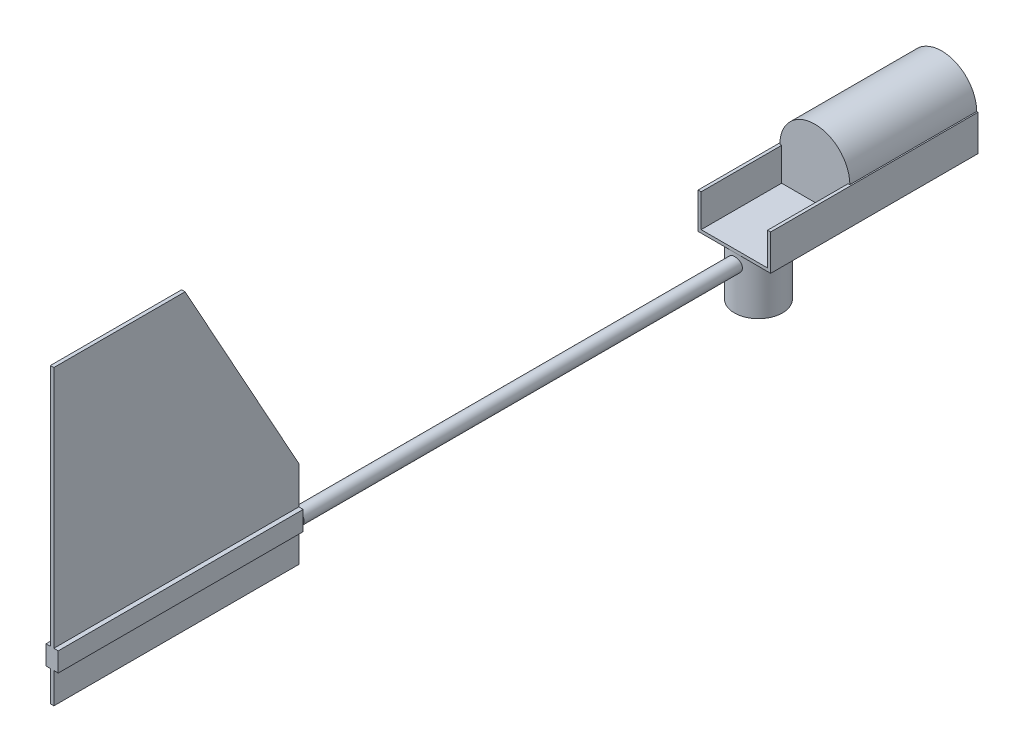
ISO-10303-21;
HEADER;
FILE_DESCRIPTION(('STEP AP214'),'2;1');
FILE_NAME('part.step','',(''),(''),'','','');
FILE_SCHEMA(('AUTOMOTIVE_DESIGN { 1 0 10303 214 1 1 1 1 }'));
ENDSEC;
DATA;
#1=APPLICATION_CONTEXT('core data for automotive mechanical design processes');
#2=APPLICATION_PROTOCOL_DEFINITION('international standard','automotive_design',2000,#1);
#3=PRODUCT_CONTEXT('',#1,'mechanical');
#4=PRODUCT('Part','Part','',(#3));
#5=PRODUCT_RELATED_PRODUCT_CATEGORY('part','',(#4));
#6=PRODUCT_DEFINITION_FORMATION('','',#4);
#7=PRODUCT_DEFINITION_CONTEXT('part definition',#1,'design');
#8=PRODUCT_DEFINITION('design','',#6,#7);
#9=PRODUCT_DEFINITION_SHAPE('','',#8);
#10=(LENGTH_UNIT() NAMED_UNIT(*) SI_UNIT(.MILLI.,.METRE.));
#11=(NAMED_UNIT(*) PLANE_ANGLE_UNIT() SI_UNIT($,.RADIAN.));
#12=(NAMED_UNIT(*) SI_UNIT($,.STERADIAN.) SOLID_ANGLE_UNIT());
#13=UNCERTAINTY_MEASURE_WITH_UNIT(LENGTH_MEASURE(1.E-05),#10,'distance_accuracy_value','');
#14=(GEOMETRIC_REPRESENTATION_CONTEXT(3) GLOBAL_UNCERTAINTY_ASSIGNED_CONTEXT((#13)) GLOBAL_UNIT_ASSIGNED_CONTEXT((#10,
#11,#12)) REPRESENTATION_CONTEXT('',''));
#15=CARTESIAN_POINT('',(0.,0.,0.));
#16=DIRECTION('',(0.,0.,1.));
#17=DIRECTION('',(1.,0.,0.));
#18=AXIS2_PLACEMENT_3D('',#15,#16,#17);
#19=CARTESIAN_POINT('',(0.,-53.,737.));
#20=DIRECTION('',(0.,0.,1.));
#21=DIRECTION('',(1.,0.,0.));
#22=AXIS2_PLACEMENT_3D('',#19,#20,#21);
#23=PLANE('',#22);
#24=CARTESIAN_POINT('',(0.,-53.,737.));
#25=DIRECTION('',(0.,0.,1.));
#26=DIRECTION('',(1.,0.,0.));
#27=AXIS2_PLACEMENT_3D('',#24,#25,#26);
#28=CIRCLE('',#27,8.);
#29=CARTESIAN_POINT('',(-7.,-49.1270166537926,737.));
#30=VERTEX_POINT('',#29);
#31=CARTESIAN_POINT('',(-7.,-56.8729833462074,737.));
#32=VERTEX_POINT('',#31);
#33=EDGE_CURVE('E347',#30,#32,#28,.T.);
#34=ORIENTED_EDGE('',*,*,#33,.T.);
#35=DIRECTION('',(0.,1.,0.));
#36=VECTOR('',#35,1.);
#37=CARTESIAN_POINT('',(-7.,-42.,737.));
#38=LINE('',#37,#36);
#39=EDGE_CURVE('E252',#32,#30,#38,.T.);
#40=ORIENTED_EDGE('',*,*,#39,.T.);
#41=EDGE_LOOP('',(#34,#40));
#42=FACE_BOUND('',#41,.T.);
#43=ADVANCED_FACE('F54',(#42),#23,.T.);
#44=CARTESIAN_POINT('',(-2.,0.,0.));
#45=DIRECTION('',(-1.,0.,0.));
#46=DIRECTION('',(0.,0.,1.));
#47=AXIS2_PLACEMENT_3D('',#44,#45,#46);
#48=PLANE('',#47);
#49=DIRECTION('',(0.,0.,-1.));
#50=VECTOR('',#49,1.);
#51=CARTESIAN_POINT('',(-2.,-64.,737.));
#52=LINE('',#51,#50);
#53=CARTESIAN_POINT('',(-2.,-64.0000000000001,1017.));
#54=VERTEX_POINT('',#53);
#55=CARTESIAN_POINT('',(-2.,-64.,737.));
#56=VERTEX_POINT('',#55);
#57=EDGE_CURVE('E265',#54,#56,#52,.T.);
#58=ORIENTED_EDGE('',*,*,#57,.T.);
#59=DIRECTION('',(0.,1.,0.));
#60=VECTOR('',#59,1.);
#61=CARTESIAN_POINT('',(-2.,1.,737.));
#62=LINE('',#61,#60);
#63=CARTESIAN_POINT('',(-2.,-99.,737.));
#64=VERTEX_POINT('',#63);
#65=EDGE_CURVE('E237',#64,#56,#62,.T.);
#66=ORIENTED_EDGE('',*,*,#65,.F.);
#67=DIRECTION('',(0.,0.,-1.));
#68=VECTOR('',#67,1.);
#69=CARTESIAN_POINT('',(-2.,-99.,737.));
#70=LINE('',#69,#68);
#71=CARTESIAN_POINT('',(-2.,-99.,1017.));
#72=VERTEX_POINT('',#71);
#73=EDGE_CURVE('E328',#72,#64,#70,.T.);
#74=ORIENTED_EDGE('',*,*,#73,.F.);
#75=DIRECTION('',(0.,-1.,0.));
#76=VECTOR('',#75,1.);
#77=CARTESIAN_POINT('',(-2.,-99.,1017.));
#78=LINE('',#77,#76);
#79=EDGE_CURVE('E324',#54,#72,#78,.T.);
#80=ORIENTED_EDGE('',*,*,#79,.F.);
#81=EDGE_LOOP('',(#58,#66,#74,#80));
#82=FACE_BOUND('',#81,.T.);
#83=ADVANCED_FACE('F492',(#82),#48,.T.);
#84=CARTESIAN_POINT('',(7.,-56.8729833462074,737.));
#85=VERTEX_POINT('',#84);
#86=CARTESIAN_POINT('',(7.,-49.1270166537926,737.));
#87=VERTEX_POINT('',#86);
#88=EDGE_CURVE('E337',#85,#87,#28,.T.);
#89=ORIENTED_EDGE('',*,*,#88,.T.);
#90=DIRECTION('',(0.,1.,0.));
#91=VECTOR('',#90,1.);
#92=CARTESIAN_POINT('',(7.,-42.,737.));
#93=LINE('',#92,#91);
#94=EDGE_CURVE('E279',#85,#87,#93,.T.);
#95=ORIENTED_EDGE('',*,*,#94,.F.);
#96=EDGE_LOOP('',(#89,#95));
#97=FACE_BOUND('',#96,.T.);
#98=ADVANCED_FACE('F495',(#97),#23,.T.);
#99=CARTESIAN_POINT('',(2.,0.,0.));
#100=DIRECTION('',(-1.,0.,0.));
#101=DIRECTION('',(0.,0.,1.));
#102=AXIS2_PLACEMENT_3D('',#99,#100,#101);
#103=PLANE('',#102);
#104=DIRECTION('',(0.,0.,1.));
#105=VECTOR('',#104,1.);
#106=CARTESIAN_POINT('',(2.,-42.,737.));
#107=LINE('',#106,#105);
#108=CARTESIAN_POINT('',(2.,-42.,737.));
#109=VERTEX_POINT('',#108);
#110=CARTESIAN_POINT('',(2.,-42.0000000000001,1017.));
#111=VERTEX_POINT('',#110);
#112=EDGE_CURVE('E241',#109,#111,#107,.T.);
#113=ORIENTED_EDGE('',*,*,#112,.F.);
#114=DIRECTION('',(0.,1.,0.));
#115=VECTOR('',#114,1.);
#116=CARTESIAN_POINT('',(2.,1.,737.));
#117=LINE('',#116,#115);
#118=CARTESIAN_POINT('',(2.,1.,737.));
#119=VERTEX_POINT('',#118);
#120=EDGE_CURVE('E315',#109,#119,#117,.T.);
#121=ORIENTED_EDGE('',*,*,#120,.T.);
#122=DIRECTION('',(0.,0.87503404241775,0.484061385167265));
#123=VECTOR('',#122,1.);
#124=CARTESIAN_POINT('',(2.,236.,867.));
#125=LINE('',#124,#123);
#126=CARTESIAN_POINT('',(2.,236.,867.));
#127=VERTEX_POINT('',#126);
#128=EDGE_CURVE('E303',#119,#127,#125,.T.);
#129=ORIENTED_EDGE('',*,*,#128,.T.);
#130=DIRECTION('',(0.,0.,1.));
#131=VECTOR('',#130,1.);
#132=CARTESIAN_POINT('',(2.,236.,1017.));
#133=LINE('',#132,#131);
#134=CARTESIAN_POINT('',(2.,236.,1017.));
#135=VERTEX_POINT('',#134);
#136=EDGE_CURVE('E306',#127,#135,#133,.T.);
#137=ORIENTED_EDGE('',*,*,#136,.T.);
#138=DIRECTION('',(0.,-1.,0.));
#139=VECTOR('',#138,1.);
#140=CARTESIAN_POINT('',(2.,-99.,1017.));
#141=LINE('',#140,#139);
#142=EDGE_CURVE('E310',#135,#111,#141,.T.);
#143=ORIENTED_EDGE('',*,*,#142,.T.);
#144=EDGE_LOOP('',(#113,#121,#129,#137,#143));
#145=FACE_BOUND('',#144,.T.);
#146=ADVANCED_FACE('F504',(#145),#103,.F.);
#147=DIRECTION('',(0.,0.,-1.));
#148=VECTOR('',#147,1.);
#149=CARTESIAN_POINT('',(2.,-64.,737.));
#150=LINE('',#149,#148);
#151=CARTESIAN_POINT('',(2.,-64.,1017.));
#152=VERTEX_POINT('',#151);
#153=CARTESIAN_POINT('',(2.,-64.,737.));
#154=VERTEX_POINT('',#153);
#155=EDGE_CURVE('E289',#152,#154,#150,.T.);
#156=ORIENTED_EDGE('',*,*,#155,.F.);
#157=CARTESIAN_POINT('',(2.,-99.,1017.));
#158=VERTEX_POINT('',#157);
#159=EDGE_CURVE('E309',#152,#158,#141,.T.);
#160=ORIENTED_EDGE('',*,*,#159,.T.);
#161=DIRECTION('',(0.,0.,-1.));
#162=VECTOR('',#161,1.);
#163=CARTESIAN_POINT('',(2.,-99.,737.));
#164=LINE('',#163,#162);
#165=CARTESIAN_POINT('',(2.,-99.,737.));
#166=VERTEX_POINT('',#165);
#167=EDGE_CURVE('E312',#158,#166,#164,.T.);
#168=ORIENTED_EDGE('',*,*,#167,.T.);
#169=EDGE_CURVE('E316',#166,#154,#117,.T.);
#170=ORIENTED_EDGE('',*,*,#169,.T.);
#171=EDGE_LOOP('',(#156,#160,#168,#170));
#172=FACE_BOUND('',#171,.T.);
#173=ADVANCED_FACE('F509',(#172),#103,.F.);
#174=CARTESIAN_POINT('',(0.,-41.,145.));
#175=DIRECTION('',(0.,1.,0.));
#176=DIRECTION('',(-1.,0.,0.));
#177=AXIS2_PLACEMENT_3D('',#174,#175,#176);
#178=PLANE('',#177);
#179=DIRECTION('',(1.,0.,0.));
#180=VECTOR('',#179,1.);
#181=CARTESIAN_POINT('',(41.5,-41.,237.));
#182=LINE('',#181,#180);
#183=CARTESIAN_POINT('',(0.,-41.,237.));
#184=VERTEX_POINT('',#183);
#185=CARTESIAN_POINT('',(41.5,-41.,237.));
#186=VERTEX_POINT('',#185);
#187=EDGE_CURVE('E358',#184,#186,#182,.T.);
#188=ORIENTED_EDGE('',*,*,#187,.F.);
#189=CARTESIAN_POINT('',(0.,-41.,209.5));
#190=DIRECTION('',(0.,-1.,0.));
#191=DIRECTION('',(1.,0.,0.));
#192=AXIS2_PLACEMENT_3D('',#189,#190,#191);
#193=CIRCLE('',#192,27.5);
#194=EDGE_CURVE('E352',#184,#184,#193,.T.);
#195=ORIENTED_EDGE('',*,*,#194,.F.);
#196=CARTESIAN_POINT('',(-41.5,-41.,237.));
#197=VERTEX_POINT('',#196);
#198=EDGE_CURVE('E360',#197,#184,#182,.T.);
#199=ORIENTED_EDGE('',*,*,#198,.F.);
#200=DIRECTION('',(0.,0.,-1.));
#201=VECTOR('',#200,1.);
#202=CARTESIAN_POINT('',(-41.5,-41.,145.));
#203=LINE('',#202,#201);
#204=CARTESIAN_POINT('',(-41.5,-41.,0.));
#205=VERTEX_POINT('',#204);
#206=EDGE_CURVE('E424',#197,#205,#203,.T.);
#207=ORIENTED_EDGE('',*,*,#206,.T.);
#208=DIRECTION('',(1.,0.,0.));
#209=VECTOR('',#208,1.);
#210=CARTESIAN_POINT('',(0.,-41.,0.));
#211=LINE('',#210,#209);
#212=CARTESIAN_POINT('',(41.5,-41.,0.));
#213=VERTEX_POINT('',#212);
#214=EDGE_CURVE('E439',#205,#213,#211,.T.);
#215=ORIENTED_EDGE('',*,*,#214,.T.);
#216=DIRECTION('',(0.,0.,-1.));
#217=VECTOR('',#216,1.);
#218=CARTESIAN_POINT('',(41.5,-41.,145.));
#219=LINE('',#218,#217);
#220=EDGE_CURVE('E428',#186,#213,#219,.T.);
#221=ORIENTED_EDGE('',*,*,#220,.F.);
#222=EDGE_LOOP('',(#188,#195,#199,#207,#215,#221));
#223=FACE_BOUND('',#222,.T.);
#224=ADVANCED_FACE('F459',(#223),#178,.F.);
#225=CARTESIAN_POINT('',(0.,0.,145.));
#226=DIRECTION('',(0.,1.,0.));
#227=DIRECTION('',(0.,0.,1.));
#228=AXIS2_PLACEMENT_3D('',#225,#226,#227);
#229=PLANE('',#228);
#230=DIRECTION('',(1.,0.,0.));
#231=VECTOR('',#230,1.);
#232=CARTESIAN_POINT('',(0.,0.,0.));
#233=LINE('',#232,#231);
#234=CARTESIAN_POINT('',(-41.5,0.,0.));
#235=VERTEX_POINT('',#234);
#236=CARTESIAN_POINT('',(-40.,0.,0.));
#237=VERTEX_POINT('',#236);
#238=EDGE_CURVE('E400',#235,#237,#233,.T.);
#239=ORIENTED_EDGE('',*,*,#238,.F.);
#240=DIRECTION('',(0.,0.,-1.));
#241=VECTOR('',#240,1.);
#242=CARTESIAN_POINT('',(-41.5,0.,145.));
#243=LINE('',#242,#241);
#244=CARTESIAN_POINT('',(-41.5,0.,237.));
#245=VERTEX_POINT('',#244);
#246=EDGE_CURVE('E419',#245,#235,#243,.T.);
#247=ORIENTED_EDGE('',*,*,#246,.F.);
#248=DIRECTION('',(-1.,0.,0.));
#249=VECTOR('',#248,1.);
#250=CARTESIAN_POINT('',(-41.5,0.,237.));
#251=LINE('',#250,#249);
#252=CARTESIAN_POINT('',(-38.,0.,237.));
#253=VERTEX_POINT('',#252);
#254=EDGE_CURVE('E373',#253,#245,#251,.T.);
#255=ORIENTED_EDGE('',*,*,#254,.F.);
#256=DIRECTION('',(0.,0.,-1.));
#257=VECTOR('',#256,1.);
#258=CARTESIAN_POINT('',(-38.,0.,237.));
#259=LINE('',#258,#257);
#260=CARTESIAN_POINT('',(-38.,0.,145.));
#261=VERTEX_POINT('',#260);
#262=EDGE_CURVE('E376',#253,#261,#259,.T.);
#263=ORIENTED_EDGE('',*,*,#262,.T.);
#264=DIRECTION('',(-1.,0.,0.));
#265=VECTOR('',#264,1.);
#266=CARTESIAN_POINT('',(-41.5,0.,145.));
#267=LINE('',#266,#265);
#268=CARTESIAN_POINT('',(-40.,0.,145.));
#269=VERTEX_POINT('',#268);
#270=EDGE_CURVE('E359',#261,#269,#267,.T.);
#271=ORIENTED_EDGE('',*,*,#270,.T.);
#272=DIRECTION('',(0.,0.,-1.));
#273=VECTOR('',#272,1.);
#274=CARTESIAN_POINT('',(-40.,0.,145.));
#275=LINE('',#274,#273);
#276=EDGE_CURVE('E67',#269,#237,#275,.T.);
#277=ORIENTED_EDGE('',*,*,#276,.T.);
#278=EDGE_LOOP('',(#239,#247,#255,#263,#271,#277));
#279=FACE_BOUND('',#278,.T.);
#280=ADVANCED_FACE('F448',(#279),#229,.T.);
#281=CARTESIAN_POINT('',(-41.5,0.,145.));
#282=DIRECTION('',(-1.,0.,0.));
#283=DIRECTION('',(0.,0.,1.));
#284=AXIS2_PLACEMENT_3D('',#281,#282,#283);
#285=PLANE('',#284);
#286=DIRECTION('',(0.,1.,0.));
#287=VECTOR('',#286,1.);
#288=CARTESIAN_POINT('',(-41.5,0.,0.));
#289=LINE('',#288,#287);
#290=EDGE_CURVE('E440',#205,#235,#289,.T.);
#291=ORIENTED_EDGE('',*,*,#290,.F.);
#292=ORIENTED_EDGE('',*,*,#206,.F.);
#293=DIRECTION('',(0.,-1.,0.));
#294=VECTOR('',#293,1.);
#295=CARTESIAN_POINT('',(-41.5,-41.,237.));
#296=LINE('',#295,#294);
#297=EDGE_CURVE('E355',#245,#197,#296,.T.);
#298=ORIENTED_EDGE('',*,*,#297,.F.);
#299=ORIENTED_EDGE('',*,*,#246,.T.);
#300=EDGE_LOOP('',(#291,#292,#298,#299));
#301=FACE_BOUND('',#300,.T.);
#302=ADVANCED_FACE('F454',(#301),#285,.T.);
#303=CARTESIAN_POINT('',(41.5,0.,145.));
#304=DIRECTION('',(-1.,0.,0.));
#305=DIRECTION('',(0.,0.,1.));
#306=AXIS2_PLACEMENT_3D('',#303,#304,#305);
#307=PLANE('',#306);
#308=DIRECTION('',(0.,1.,0.));
#309=VECTOR('',#308,1.);
#310=CARTESIAN_POINT('',(41.5,0.,0.));
#311=LINE('',#310,#309);
#312=CARTESIAN_POINT('',(41.5,0.,0.));
#313=VERTEX_POINT('',#312);
#314=EDGE_CURVE('E437',#213,#313,#311,.T.);
#315=ORIENTED_EDGE('',*,*,#314,.T.);
#316=DIRECTION('',(0.,0.,-1.));
#317=VECTOR('',#316,1.);
#318=CARTESIAN_POINT('',(41.5,0.,145.));
#319=LINE('',#318,#317);
#320=CARTESIAN_POINT('',(41.5,0.,237.));
#321=VERTEX_POINT('',#320);
#322=EDGE_CURVE('E410',#321,#313,#319,.T.);
#323=ORIENTED_EDGE('',*,*,#322,.F.);
#324=DIRECTION('',(0.,1.,0.));
#325=VECTOR('',#324,1.);
#326=CARTESIAN_POINT('',(41.5,0.,237.));
#327=LINE('',#326,#325);
#328=EDGE_CURVE('E362',#186,#321,#327,.T.);
#329=ORIENTED_EDGE('',*,*,#328,.F.);
#330=ORIENTED_EDGE('',*,*,#220,.T.);
#331=EDGE_LOOP('',(#315,#323,#329,#330));
#332=FACE_BOUND('',#331,.T.);
#333=ADVANCED_FACE('F464',(#332),#307,.F.);
#334=CARTESIAN_POINT('',(0.,0.,145.));
#335=DIRECTION('',(0.,-1.,0.));
#336=DIRECTION('',(0.,0.,-1.));
#337=AXIS2_PLACEMENT_3D('',#334,#335,#336);
#338=PLANE('',#337);
#339=DIRECTION('',(-1.,0.,0.));
#340=VECTOR('',#339,1.);
#341=CARTESIAN_POINT('',(0.,0.,0.));
#342=LINE('',#341,#340);
#343=CARTESIAN_POINT('',(40.,0.,0.));
#344=VERTEX_POINT('',#343);
#345=EDGE_CURVE('E411',#313,#344,#342,.T.);
#346=ORIENTED_EDGE('',*,*,#345,.T.);
#347=DIRECTION('',(0.,0.,-1.));
#348=VECTOR('',#347,1.);
#349=CARTESIAN_POINT('',(40.,0.,145.));
#350=LINE('',#349,#348);
#351=CARTESIAN_POINT('',(40.,0.,145.));
#352=VERTEX_POINT('',#351);
#353=EDGE_CURVE('E408',#352,#344,#350,.T.);
#354=ORIENTED_EDGE('',*,*,#353,.F.);
#355=DIRECTION('',(-1.,0.,0.));
#356=VECTOR('',#355,1.);
#357=CARTESIAN_POINT('',(38.,0.,145.));
#358=LINE('',#357,#356);
#359=CARTESIAN_POINT('',(38.,0.,145.));
#360=VERTEX_POINT('',#359);
#361=EDGE_CURVE('E12',#352,#360,#358,.T.);
#362=ORIENTED_EDGE('',*,*,#361,.T.);
#363=DIRECTION('',(0.,0.,-1.));
#364=VECTOR('',#363,1.);
#365=CARTESIAN_POINT('',(38.,0.,237.));
#366=LINE('',#365,#364);
#367=CARTESIAN_POINT('',(38.,0.,237.));
#368=VERTEX_POINT('',#367);
#369=EDGE_CURVE('E393',#368,#360,#366,.T.);
#370=ORIENTED_EDGE('',*,*,#369,.F.);
#371=DIRECTION('',(-1.,0.,0.));
#372=VECTOR('',#371,1.);
#373=CARTESIAN_POINT('',(38.,0.,237.));
#374=LINE('',#373,#372);
#375=EDGE_CURVE('E365',#321,#368,#374,.T.);
#376=ORIENTED_EDGE('',*,*,#375,.F.);
#377=ORIENTED_EDGE('',*,*,#322,.T.);
#378=EDGE_LOOP('',(#346,#354,#362,#370,#376,#377));
#379=FACE_BOUND('',#378,.T.);
#380=ADVANCED_FACE('F468',(#379),#338,.F.);
#381=CARTESIAN_POINT('',(0.,0.,0.));
#382=DIRECTION('',(0.,0.,1.));
#383=DIRECTION('',(1.,0.,0.));
#384=AXIS2_PLACEMENT_3D('',#381,#382,#383);
#385=PLANE('',#384);
#386=ORIENTED_EDGE('',*,*,#238,.T.);
#387=CARTESIAN_POINT('',(0.,0.,0.));
#388=DIRECTION('',(0.,0.,1.));
#389=DIRECTION('',(1.,0.,0.));
#390=AXIS2_PLACEMENT_3D('',#387,#388,#389);
#391=CIRCLE('',#390,40.);
#392=EDGE_CURVE('E396',#344,#237,#391,.T.);
#393=ORIENTED_EDGE('',*,*,#392,.F.);
#394=ORIENTED_EDGE('',*,*,#345,.F.);
#395=ORIENTED_EDGE('',*,*,#314,.F.);
#396=ORIENTED_EDGE('',*,*,#214,.F.);
#397=ORIENTED_EDGE('',*,*,#290,.T.);
#398=EDGE_LOOP('',(#386,#393,#394,#395,#396,#397));
#399=FACE_BOUND('',#398,.T.);
#400=ADVANCED_FACE('F446',(#399),#385,.F.);
#401=CARTESIAN_POINT('',(0.,0.,145.));
#402=DIRECTION('',(0.,0.,1.));
#403=DIRECTION('',(1.,0.,0.));
#404=AXIS2_PLACEMENT_3D('',#401,#402,#403);
#405=PLANE('',#404);
#406=ORIENTED_EDGE('',*,*,#270,.F.);
#407=DIRECTION('',(0.,1.,0.));
#408=VECTOR('',#407,1.);
#409=CARTESIAN_POINT('',(-38.,0.,145.));
#410=LINE('',#409,#408);
#411=CARTESIAN_POINT('',(-38.,-37.5,145.));
#412=VERTEX_POINT('',#411);
#413=EDGE_CURVE('E382',#412,#261,#410,.T.);
#414=ORIENTED_EDGE('',*,*,#413,.F.);
#415=DIRECTION('',(-1.,0.,0.));
#416=VECTOR('',#415,1.);
#417=CARTESIAN_POINT('',(-38.,-37.5,145.));
#418=LINE('',#417,#416);
#419=CARTESIAN_POINT('',(38.,-37.5,145.));
#420=VERTEX_POINT('',#419);
#421=EDGE_CURVE('E379',#420,#412,#418,.T.);
#422=ORIENTED_EDGE('',*,*,#421,.F.);
#423=DIRECTION('',(0.,-1.,0.));
#424=VECTOR('',#423,1.);
#425=CARTESIAN_POINT('',(38.,-37.5,145.));
#426=LINE('',#425,#424);
#427=EDGE_CURVE('E351',#360,#420,#426,.T.);
#428=ORIENTED_EDGE('',*,*,#427,.F.);
#429=ORIENTED_EDGE('',*,*,#361,.F.);
#430=CARTESIAN_POINT('',(0.,0.,145.));
#431=DIRECTION('',(0.,0.,1.));
#432=DIRECTION('',(1.,0.,0.));
#433=AXIS2_PLACEMENT_3D('',#430,#431,#432);
#434=CIRCLE('',#433,40.);
#435=EDGE_CURVE('E414',#352,#269,#434,.T.);
#436=ORIENTED_EDGE('',*,*,#435,.T.);
#437=EDGE_LOOP('',(#406,#414,#422,#428,#429,#436));
#438=FACE_BOUND('',#437,.T.);
#439=ADVANCED_FACE('F481',(#438),#405,.T.);
#440=CARTESIAN_POINT('',(0.,0.,145.));
#441=DIRECTION('',(0.,0.,-1.));
#442=DIRECTION('',(-1.,0.,0.));
#443=AXIS2_PLACEMENT_3D('',#440,#441,#442);
#444=CYLINDRICAL_SURFACE('',#443,40.);
#445=ORIENTED_EDGE('',*,*,#276,.F.);
#446=ORIENTED_EDGE('',*,*,#435,.F.);
#447=ORIENTED_EDGE('',*,*,#353,.T.);
#448=ORIENTED_EDGE('',*,*,#392,.T.);
#449=EDGE_LOOP('',(#445,#446,#447,#448));
#450=FACE_BOUND('',#449,.T.);
#451=ADVANCED_FACE('F56',(#450),#444,.T.);
#452=CARTESIAN_POINT('',(38.,-37.5,237.));
#453=DIRECTION('',(1.,0.,0.));
#454=DIRECTION('',(0.,0.,-1.));
#455=AXIS2_PLACEMENT_3D('',#452,#453,#454);
#456=PLANE('',#455);
#457=ORIENTED_EDGE('',*,*,#427,.T.);
#458=DIRECTION('',(0.,0.,-1.));
#459=VECTOR('',#458,1.);
#460=CARTESIAN_POINT('',(38.,-37.5,237.));
#461=LINE('',#460,#459);
#462=CARTESIAN_POINT('',(38.,-37.5,237.));
#463=VERTEX_POINT('',#462);
#464=EDGE_CURVE('E390',#463,#420,#461,.T.);
#465=ORIENTED_EDGE('',*,*,#464,.F.);
#466=DIRECTION('',(0.,-1.,0.));
#467=VECTOR('',#466,1.);
#468=CARTESIAN_POINT('',(38.,-37.5,237.));
#469=LINE('',#468,#467);
#470=EDGE_CURVE('E367',#368,#463,#469,.T.);
#471=ORIENTED_EDGE('',*,*,#470,.F.);
#472=ORIENTED_EDGE('',*,*,#369,.T.);
#473=EDGE_LOOP('',(#457,#465,#471,#472));
#474=FACE_BOUND('',#473,.T.);
#475=ADVANCED_FACE('F473',(#474),#456,.F.);
#476=CARTESIAN_POINT('',(-38.,-37.5,237.));
#477=DIRECTION('',(0.,-1.,0.));
#478=DIRECTION('',(0.,0.,-1.));
#479=AXIS2_PLACEMENT_3D('',#476,#477,#478);
#480=PLANE('',#479);
#481=ORIENTED_EDGE('',*,*,#421,.T.);
#482=DIRECTION('',(0.,0.,-1.));
#483=VECTOR('',#482,1.);
#484=CARTESIAN_POINT('',(-38.,-37.5,237.));
#485=LINE('',#484,#483);
#486=CARTESIAN_POINT('',(-38.,-37.5,237.));
#487=VERTEX_POINT('',#486);
#488=EDGE_CURVE('E387',#487,#412,#485,.T.);
#489=ORIENTED_EDGE('',*,*,#488,.F.);
#490=DIRECTION('',(-1.,0.,0.));
#491=VECTOR('',#490,1.);
#492=CARTESIAN_POINT('',(-38.,-37.5,237.));
#493=LINE('',#492,#491);
#494=EDGE_CURVE('E369',#463,#487,#493,.T.);
#495=ORIENTED_EDGE('',*,*,#494,.F.);
#496=ORIENTED_EDGE('',*,*,#464,.T.);
#497=EDGE_LOOP('',(#481,#489,#495,#496));
#498=FACE_BOUND('',#497,.T.);
#499=ADVANCED_FACE('F477',(#498),#480,.F.);
#500=CARTESIAN_POINT('',(-38.,0.,237.));
#501=DIRECTION('',(-1.,0.,0.));
#502=DIRECTION('',(0.,-1.,0.));
#503=AXIS2_PLACEMENT_3D('',#500,#501,#502);
#504=PLANE('',#503);
#505=ORIENTED_EDGE('',*,*,#413,.T.);
#506=ORIENTED_EDGE('',*,*,#262,.F.);
#507=DIRECTION('',(0.,1.,0.));
#508=VECTOR('',#507,1.);
#509=CARTESIAN_POINT('',(-38.,0.,237.));
#510=LINE('',#509,#508);
#511=EDGE_CURVE('E371',#487,#253,#510,.T.);
#512=ORIENTED_EDGE('',*,*,#511,.F.);
#513=ORIENTED_EDGE('',*,*,#488,.T.);
#514=EDGE_LOOP('',(#505,#506,#512,#513));
#515=FACE_BOUND('',#514,.T.);
#516=ADVANCED_FACE('F479',(#515),#504,.F.);
#517=CARTESIAN_POINT('',(0.,0.,237.));
#518=DIRECTION('',(0.,0.,-1.));
#519=DIRECTION('',(-1.,0.,0.));
#520=AXIS2_PLACEMENT_3D('',#517,#518,#519);
#521=PLANE('',#520);
#522=ORIENTED_EDGE('',*,*,#297,.T.);
#523=ORIENTED_EDGE('',*,*,#198,.T.);
#524=ORIENTED_EDGE('',*,*,#187,.T.);
#525=ORIENTED_EDGE('',*,*,#328,.T.);
#526=ORIENTED_EDGE('',*,*,#375,.T.);
#527=ORIENTED_EDGE('',*,*,#470,.T.);
#528=ORIENTED_EDGE('',*,*,#494,.T.);
#529=ORIENTED_EDGE('',*,*,#511,.T.);
#530=ORIENTED_EDGE('',*,*,#254,.T.);
#531=EDGE_LOOP('',(#522,#523,#524,#525,#526,#527,#528,#529,#530));
#532=FACE_BOUND('',#531,.T.);
#533=ADVANCED_FACE('F451',(#532),#521,.F.);
#534=CARTESIAN_POINT('',(0.,-101.,209.5));
#535=DIRECTION('',(0.,1.,0.));
#536=DIRECTION('',(-1.,0.,0.));
#537=AXIS2_PLACEMENT_3D('',#534,#535,#536);
#538=CYLINDRICAL_SURFACE('',#537,27.5);
#539=CARTESIAN_POINT('',(8.,-53.,235.810644233846));
#540=CARTESIAN_POINT('',(7.99999945179375,-53.2195284933203,235.810644627825));
#541=CARTESIAN_POINT('',(7.99095621605924,-53.4390667886356,235.81339923787));
#542=CARTESIAN_POINT('',(7.9548648481875,-53.8765283572211,235.8243323868));
#543=CARTESIAN_POINT('',(7.92781563727063,-54.0944515329347,235.832511250665));
#544=CARTESIAN_POINT('',(7.85595348818416,-54.5271190259457,235.854039520795));
#545=CARTESIAN_POINT('',(7.81113805914129,-54.7418628931139,235.867389652081));
#546=CARTESIAN_POINT('',(7.70411785226968,-55.1666961779149,235.898857457303));
#547=CARTESIAN_POINT('',(7.64190660087654,-55.3767838313439,235.916976905913));
#548=CARTESIAN_POINT('',(7.50076476429704,-55.7903724571894,235.957397832435));
#549=CARTESIAN_POINT('',(7.4218678506472,-55.9938857572067,235.979690877816));
#550=CARTESIAN_POINT('',(7.24786837620966,-56.39351113375,236.027844803789));
#551=CARTESIAN_POINT('',(7.15275971697762,-56.5896203910291,236.053707026315));
#552=CARTESIAN_POINT('',(6.94709150128411,-56.9730640283653,236.108254898182));
#553=CARTESIAN_POINT('',(6.83653691259477,-57.160401203966,236.13693963886));
#554=CARTESIAN_POINT('',(6.60066425359247,-57.5253126314915,236.196367260479));
#555=CARTESIAN_POINT('',(6.47533940898102,-57.7028823484327,236.227111082993));
#556=CARTESIAN_POINT('',(6.20721453337387,-58.0517503791642,236.290669500611));
#557=CARTESIAN_POINT('',(6.06403456301979,-58.2227506992119,236.323517573984));
#558=CARTESIAN_POINT('',(5.76401140950861,-58.5520963289051,236.389584444811));
#559=CARTESIAN_POINT('',(5.6071740347035,-58.7104469639218,236.422803079479));
#560=CARTESIAN_POINT('',(5.28069238559433,-59.0136463838054,236.488738957744));
#561=CARTESIAN_POINT('',(5.11104139596731,-59.1584879987896,236.521455927475));
#562=CARTESIAN_POINT('',(4.7601383199541,-59.4335654883437,236.585473490349));
#563=CARTESIAN_POINT('',(4.57889061664411,-59.5638068305849,236.616774611079));
#564=CARTESIAN_POINT('',(4.20218730322294,-59.8112703623205,236.677724964595));
#565=CARTESIAN_POINT('',(4.00652158072099,-59.9281840946707,236.707329279453));
#566=CARTESIAN_POINT('',(3.60564297750063,-60.1450156390913,236.763350455151));
#567=CARTESIAN_POINT('',(3.40043361854105,-60.2449396582554,236.789768479053));
#568=CARTESIAN_POINT('',(2.98181835773692,-60.4270356591263,236.838675208877));
#569=CARTESIAN_POINT('',(2.76841216822794,-60.5092070171391,236.861163776741));
#570=CARTESIAN_POINT('',(2.33495675241617,-60.6550808217308,236.901557354158));
#571=CARTESIAN_POINT('',(2.11490773877811,-60.7187838588674,236.919462510272));
#572=CARTESIAN_POINT('',(1.67582913052341,-60.8256798539661,236.949748803035));
#573=CARTESIAN_POINT('',(1.45693234498932,-60.86938001515,236.962266000804));
#574=CARTESIAN_POINT('',(1.01602435059151,-60.9383549643468,236.982110282693));
#575=CARTESIAN_POINT('',(0.794013235217727,-60.9636303042582,236.989437522274));
#576=CARTESIAN_POINT('',(0.348579101650477,-60.9955201353201,236.998692858357));
#577=CARTESIAN_POINT('',(0.125156321761038,-61.0021376959779,237.000621842959));
#578=CARTESIAN_POINT('',(-0.321438115795961,-60.9966583042656,236.99902791463));
#579=CARTESIAN_POINT('',(-0.54460977770968,-60.9845616732415,236.995505095312));
#580=CARTESIAN_POINT('',(-0.98229608355238,-60.9424155552607,236.98329630064));
#581=CARTESIAN_POINT('',(-1.19686869266525,-60.9129190262602,236.974769393356));
#582=CARTESIAN_POINT('',(-1.62275153736993,-60.8366759451434,236.952907981206));
#583=CARTESIAN_POINT('',(-1.83406065454031,-60.7899236102656,236.939571864714));
#584=CARTESIAN_POINT('',(-2.25182274086715,-60.679580482754,236.908450496183));
#585=CARTESIAN_POINT('',(-2.45827725208359,-60.6159951179863,236.890666678421));
#586=CARTESIAN_POINT('',(-2.86510695360696,-60.4724634052202,236.851105128938));
#587=CARTESIAN_POINT('',(-3.06547982745752,-60.3925109107033,236.829325897098));
#588=CARTESIAN_POINT('',(-3.46091265017092,-60.2159183913119,236.782085052425));
#589=CARTESIAN_POINT('',(-3.65589166489465,-60.119107182847,236.756586149253));
#590=CARTESIAN_POINT('',(-4.03708189332403,-59.9100823104785,236.70273957043));
#591=CARTESIAN_POINT('',(-4.22329006643244,-59.7978633571734,236.674390917372));
#592=CARTESIAN_POINT('',(-4.58573407039554,-59.5588238727349,236.615581395908));
#593=CARTESIAN_POINT('',(-4.76196974499262,-59.4320031129024,236.58512049442));
#594=CARTESIAN_POINT('',(-5.10341510015708,-59.1645909449079,236.522865809452));
#595=CARTESIAN_POINT('',(-5.26862447884707,-59.0239991599833,236.491071989518));
#596=CARTESIAN_POINT('',(-5.59285522425001,-58.7245463331405,236.425792664372));
#597=CARTESIAN_POINT('',(-5.75142981966767,-58.5652054123816,236.3922877979));
#598=CARTESIAN_POINT('',(-6.05459840673731,-58.2337620161093,236.325657969952));
#599=CARTESIAN_POINT('',(-6.19919690528551,-58.0616636863443,236.292532889063));
#600=CARTESIAN_POINT('',(-6.47357454289551,-57.70567289183,236.22756486731));
#601=CARTESIAN_POINT('',(-6.60334681054028,-57.5217750195851,236.195722525338));
#602=CARTESIAN_POINT('',(-6.84703903832334,-57.1435074642631,236.134260790969));
#603=CARTESIAN_POINT('',(-6.96096515364381,-56.9491418881224,236.104640537509));
#604=CARTESIAN_POINT('',(-7.1731290701947,-56.5493502614839,236.048227509));
#605=CARTESIAN_POINT('',(-7.27121673583654,-56.3438405328447,236.02146252608));
#606=CARTESIAN_POINT('',(-7.44962594219684,-55.9248747149302,235.971903010099));
#607=CARTESIAN_POINT('',(-7.52995423618211,-55.7114216824145,235.949106968492));
#608=CARTESIAN_POINT('',(-7.67219415037952,-55.278035646122,235.908197961217));
#609=CARTESIAN_POINT('',(-7.73410675888565,-55.0581029907764,235.890084744247));
#610=CARTESIAN_POINT('',(-7.83894997664924,-54.6133958737486,235.859132348663));
#611=CARTESIAN_POINT('',(-7.8818812949874,-54.3886215932631,235.846292973035));
#612=CARTESIAN_POINT('',(-7.94717989564276,-53.9439491972863,235.826668054883));
#613=CARTESIAN_POINT('',(-7.97021812870661,-53.7241581263594,235.819685240707));
#614=CARTESIAN_POINT('',(-7.99803127389568,-53.2833194249826,235.811246833852));
#615=CARTESIAN_POINT('',(-8.0028066355227,-53.0622718255936,235.809791105135));
#616=CARTESIAN_POINT('',(-7.99405024782548,-52.6206006700592,235.81245295433));
#617=CARTESIAN_POINT('',(-7.9805206522272,-52.3999770670856,235.816569876573));
#618=CARTESIAN_POINT('',(-7.93528478882799,-51.9607739699767,235.830245194865));
#619=CARTESIAN_POINT('',(-7.90357865652597,-51.7421944606159,235.83980355035));
#620=CARTESIAN_POINT('',(-7.82326642080169,-51.313935258964,235.863766967412));
#621=CARTESIAN_POINT('',(-7.77508810871364,-51.1041682222389,235.878049070773));
#622=CARTESIAN_POINT('',(-7.66208752443833,-50.6894546576376,235.911093832627));
#623=CARTESIAN_POINT('',(-7.59725967675008,-50.4845097697205,235.929857991899));
#624=CARTESIAN_POINT('',(-7.45150237983765,-50.0809009572947,235.971321206369));
#625=CARTESIAN_POINT('',(-7.37057685908643,-49.882235514033,235.994019301355));
#626=CARTESIAN_POINT('',(-7.19318868754384,-49.492303512481,236.042729591316));
#627=CARTESIAN_POINT('',(-7.09672017094121,-49.3010397814719,236.068743036701));
#628=CARTESIAN_POINT('',(-6.88633133595215,-48.9224378951006,236.124059837441));
#629=CARTESIAN_POINT('',(-6.77203320594877,-48.735319357688,236.153429466937));
#630=CARTESIAN_POINT('',(-6.52859566476191,-48.3712408324826,236.214100658087));
#631=CARTESIAN_POINT('',(-6.39945111764478,-48.194284392078,236.245402886555));
#632=CARTESIAN_POINT('',(-6.12719454520452,-47.8516637476246,236.309084772819));
#633=CARTESIAN_POINT('',(-5.98408209984453,-47.685999883416,236.341464462997));
#634=CARTESIAN_POINT('',(-5.68479101186874,-47.3669731090901,236.406441545576));
#635=CARTESIAN_POINT('',(-5.52861216510289,-47.2136103912396,236.439038941371));
#636=CARTESIAN_POINT('',(-5.19838932904605,-46.9149322950442,236.504741725933));
#637=CARTESIAN_POINT('',(-5.02390848175068,-46.7700943947249,236.537824208458));
#638=CARTESIAN_POINT('',(-4.66315476240232,-46.4956680658924,236.602371632652));
#639=CARTESIAN_POINT('',(-4.47688593051787,-46.3660744556784,236.633837121896));
#640=CARTESIAN_POINT('',(-4.09365182879047,-46.1229713765968,236.694294472575));
#641=CARTESIAN_POINT('',(-3.89668278945643,-46.0094676273934,236.723285452916));
#642=CARTESIAN_POINT('',(-3.49351424480264,-45.7995145160435,236.777952953281));
#643=CARTESIAN_POINT('',(-3.28731856798632,-45.7030581609908,236.803630831179));
#644=CARTESIAN_POINT('',(-2.86859160617169,-45.5285711532952,236.850781363878));
#645=CARTESIAN_POINT('',(-2.6561175944746,-45.4504110691092,236.872283362855));
#646=CARTESIAN_POINT('',(-2.22500990081539,-45.3123124556003,236.910693869016));
#647=CARTESIAN_POINT('',(-2.00637864444955,-45.2523668575783,236.927604157885));
#648=CARTESIAN_POINT('',(-1.56450242568913,-45.1511973834095,236.956353502077));
#649=CARTESIAN_POINT('',(-1.34125759546941,-45.1099729716923,236.968192702472));
#650=CARTESIAN_POINT('',(-0.8918561652678,-45.0466308351972,236.986454079507));
#651=CARTESIAN_POINT('',(-0.66569965608549,-45.0245125160608,236.992876424657));
#652=CARTESIAN_POINT('',(-0.22048310887511,-45.0000454588922,236.999984451926));
#653=CARTESIAN_POINT('',(-0.0014638511217593,-44.9970074944102,237.000870125736));
#654=CARTESIAN_POINT('',(0.436044224077933,-45.0088954726373,236.997412937461));
#655=CARTESIAN_POINT('',(0.654533048209528,-45.0238211877532,236.99307014162));
#656=CARTESIAN_POINT('',(1.08937731171931,-45.0715009891375,236.979275421061));
#657=CARTESIAN_POINT('',(1.30573288098613,-45.1042539830363,236.969823809389));
#658=CARTESIAN_POINT('',(1.7347785079477,-45.1872995471892,236.946069067754));
#659=CARTESIAN_POINT('',(1.94746855042635,-45.2375921902343,236.931765917658));
#660=CARTESIAN_POINT('',(2.36564257054651,-45.3547124283974,236.898855787567));
#661=CARTESIAN_POINT('',(2.57117668667126,-45.4213734631259,236.880292277084));
#662=CARTESIAN_POINT('',(2.97590890774863,-45.5709671119578,236.839264020608));
#663=CARTESIAN_POINT('',(3.17510485419922,-45.6539052018223,236.816797962054));
#664=CARTESIAN_POINT('',(3.56580714289958,-45.8354054469249,236.768549022998));
#665=CARTESIAN_POINT('',(3.75731402090526,-45.9339665112153,236.742766374117));
#666=CARTESIAN_POINT('',(4.13148760728456,-46.1460188023157,236.68853720088));
#667=CARTESIAN_POINT('',(4.31415382344171,-46.2595108591249,236.660090528459));
#668=CARTESIAN_POINT('',(4.67498328562827,-46.5043470665049,236.600350351174));
#669=CARTESIAN_POINT('',(4.85283839920335,-46.6361307345777,236.568996418993));
#670=CARTESIAN_POINT('',(5.19689253649974,-46.913852875069,236.505053809567));
#671=CARTESIAN_POINT('',(5.36309136620274,-47.0597915830012,236.472465111783));
#672=CARTESIAN_POINT('',(5.68284904695301,-47.3649243862334,236.406911280245));
#673=CARTESIAN_POINT('',(5.83640440180869,-47.5241221236227,236.373946045222));
#674=CARTESIAN_POINT('',(6.12985616805222,-47.8547382023984,236.308533480018));
#675=CARTESIAN_POINT('',(6.26975278160133,-48.0261563628469,236.276086142177));
#676=CARTESIAN_POINT('',(6.53866996748892,-48.3850822845245,236.21170986181));
#677=CARTESIAN_POINT('',(6.66728036150434,-48.5729047546593,236.17982037076));
#678=CARTESIAN_POINT('',(6.90814288549597,-48.9590444854217,236.118471193469));
#679=CARTESIAN_POINT('',(7.02040095451855,-49.1573578999625,236.089010626756));
#680=CARTESIAN_POINT('',(7.22772636807561,-49.5631594396765,236.033403360154));
#681=CARTESIAN_POINT('',(7.32279814334808,-49.7706451829474,236.00725580667));
#682=CARTESIAN_POINT('',(7.49499748239726,-50.1933849035855,235.959081925839));
#683=CARTESIAN_POINT('',(7.57212701233311,-50.4086380267936,235.937055146979));
#684=CARTESIAN_POINT('',(7.69936973378417,-50.8182931360352,235.900256154293));
#685=CARTESIAN_POINT('',(7.75164574571517,-51.0119761216113,235.884923344928));
#686=CARTESIAN_POINT('',(7.84154185689996,-51.4029854698664,235.858346371666));
#687=CARTESIAN_POINT('',(7.87916292006729,-51.6003115920276,235.847101938864));
#688=CARTESIAN_POINT('',(7.9394720602434,-51.9974420925457,235.828991191026));
#689=CARTESIAN_POINT('',(7.96215948857338,-52.1972465781723,235.822125066174));
#690=CARTESIAN_POINT('',(7.9924212104324,-52.598031577766,235.812952161122));
#691=CARTESIAN_POINT('',(8.00000050190775,-52.7990116807516,235.810643873139));
#692=CARTESIAN_POINT('',(8.,-53.,235.810644233846));
#693=B_SPLINE_CURVE_WITH_KNOTS('',3,(#539,#540,#541,#542,#543,#544,#545,#546,#547,#548,#549,
#550,#551,#552,#553,#554,#555,#556,#557,#558,#559,#560,#561,#562,#563,#564,#565,#566,#567,#568,
#569,#570,#571,#572,#573,#574,#575,#576,#577,#578,#579,#580,#581,#582,#583,#584,#585,#586,#587,
#588,#589,#590,#591,#592,#593,#594,#595,#596,#597,#598,#599,#600,#601,#602,#603,#604,#605,#606,
#607,#608,#609,#610,#611,#612,#613,#614,#615,#616,#617,#618,#619,#620,#621,#622,#623,#624,#625,
#626,#627,#628,#629,#630,#631,#632,#633,#634,#635,#636,#637,#638,#639,#640,#641,#642,#643,#644,
#645,#646,#647,#648,#649,#650,#651,#652,#653,#654,#655,#656,#657,#658,#659,#660,#661,#662,#663,
#664,#665,#666,#667,#668,#669,#670,#671,#672,#673,#674,#675,#676,#677,#678,#679,#680,#681,#682,
#683,#684,#685,#686,#687,#688,#689,#690,#691,#692),.UNSPECIFIED.,.T.,.F.,(4,2,2,2,2,2,2,2,2,2,2,
2,2,2,2,2,2,2,2,2,2,2,2,2,2,2,2,2,2,2,2,2,2,2,2,2,2,2,2,2,2,2,2,2,2,2,2,2,2,2,2,2,2,2,2,2,2,2,2,
2,2,2,2,2,2,2,2,2,2,2,2,2,2,2,2,2,4),(0.,0.658399899679274,1.3168392491709,1.97537094636043,
2.63414803199365,3.29160818371737,3.94931620316693,4.60681317321941,5.26461288293193,
5.94014071412024,6.61538264051163,7.29098093459483,7.96632537196181,8.65502743794519,
9.34347734741104,10.0319514398612,10.7204035146867,11.3902726022247,12.0601216236278,
12.7298604375732,13.3995877513978,14.0490982943214,14.698826698984,15.3483458512243,
15.9981093730992,16.6549026734731,17.3119220140843,17.9689516465867,18.6259992598418,
19.3070582160167,19.9878968120236,20.6690496826911,21.349937227182,22.0369417325761,
22.7236845431645,23.4103904924422,24.097070786399,24.7595685695871,25.4220500466943,
26.0844535842868,26.7468521839865,27.393211982694,28.0397885135338,28.6862074471192,
29.3328709083012,29.995793711666,30.6589465389868,31.3221193145127,31.9853024534156,
32.6719768020045,33.3584170638628,34.0451007345703,34.7315020679139,35.4128900870021,
36.0940133334973,36.775117093386,37.4561996645208,38.1125313489976,38.7688547180845,
39.4251378753725,40.0814237563266,40.7312897322907,41.3813747054556,42.0314143033652,
42.6814900516206,43.3514290949511,44.0213792867405,44.6915141162646,45.3616390257062,
46.0503828692967,46.7388759390455,47.4271912568885,48.1154311117326,48.7184391522252,
49.3214075238104,49.9244020850667,50.5271971356246),.UNSPECIFIED.);
#694=CARTESIAN_POINT('',(8.,-53.,235.810644233846));
#695=VERTEX_POINT('',#694);
#696=EDGE_CURVE('E58',#695,#695,#693,.T.);
#697=ORIENTED_EDGE('',*,*,#696,.T.);
#698=EDGE_LOOP('',(#697));
#699=FACE_BOUND('',#698,.T.);
#700=CARTESIAN_POINT('',(0.,-101.,209.5));
#701=DIRECTION('',(0.,-1.,0.));
#702=DIRECTION('',(1.,0.,0.));
#703=AXIS2_PLACEMENT_3D('',#700,#701,#702);
#704=CIRCLE('',#703,27.5);
#705=CARTESIAN_POINT('',(27.5,-101.,209.5));
#706=VERTEX_POINT('',#705);
#707=EDGE_CURVE('E348',#706,#706,#704,.T.);
#708=ORIENTED_EDGE('',*,*,#707,.F.);
#709=EDGE_LOOP('',(#708));
#710=FACE_BOUND('',#709,.T.);
#711=ORIENTED_EDGE('',*,*,#194,.T.);
#712=EDGE_LOOP('',(#711));
#713=FACE_BOUND('',#712,.T.);
#714=ADVANCED_FACE('F581',(#699,#710,#713),#538,.T.);
#715=CARTESIAN_POINT('',(0.,-101.,209.5));
#716=DIRECTION('',(0.,-1.,0.));
#717=DIRECTION('',(1.,0.,0.));
#718=AXIS2_PLACEMENT_3D('',#715,#716,#717);
#719=PLANE('',#718);
#720=ORIENTED_EDGE('',*,*,#707,.T.);
#721=EDGE_LOOP('',(#720));
#722=FACE_BOUND('',#721,.T.);
#723=ADVANCED_FACE('F577',(#722),#719,.T.);
#724=CARTESIAN_POINT('',(0.,-53.,197.));
#725=DIRECTION('',(0.,0.,1.));
#726=DIRECTION('',(1.,0.,0.));
#727=AXIS2_PLACEMENT_3D('',#724,#725,#726);
#728=CYLINDRICAL_SURFACE('',#727,8.);
#729=EDGE_CURVE('E83',#87,#30,#28,.T.);
#730=ORIENTED_EDGE('',*,*,#729,.F.);
#731=ORIENTED_EDGE('',*,*,#88,.F.);
#732=EDGE_CURVE('E75',#32,#85,#28,.T.);
#733=ORIENTED_EDGE('',*,*,#732,.F.);
#734=ORIENTED_EDGE('',*,*,#33,.F.);
#735=EDGE_LOOP('',(#730,#731,#733,#734));
#736=FACE_BOUND('',#735,.T.);
#737=ORIENTED_EDGE('',*,*,#696,.F.);
#738=EDGE_LOOP('',(#737));
#739=FACE_BOUND('',#738,.T.);
#740=ADVANCED_FACE('F525',(#736,#739),#728,.T.);
#741=CARTESIAN_POINT('',(-2.,1.,737.));
#742=DIRECTION('',(0.,0.,-1.));
#743=DIRECTION('',(-1.,0.,0.));
#744=AXIS2_PLACEMENT_3D('',#741,#742,#743);
#745=PLANE('',#744);
#746=ORIENTED_EDGE('',*,*,#120,.F.);
#747=DIRECTION('',(-1.,0.,0.));
#748=VECTOR('',#747,1.);
#749=CARTESIAN_POINT('',(7.,-42.,737.));
#750=LINE('',#749,#748);
#751=CARTESIAN_POINT('',(7.,-42.,737.));
#752=VERTEX_POINT('',#751);
#753=EDGE_CURVE('E300',#752,#109,#750,.T.);
#754=ORIENTED_EDGE('',*,*,#753,.F.);
#755=EDGE_CURVE('E280',#87,#752,#93,.T.);
#756=ORIENTED_EDGE('',*,*,#755,.F.);
#757=ORIENTED_EDGE('',*,*,#729,.T.);
#758=CARTESIAN_POINT('',(-7.,-42.,737.));
#759=VERTEX_POINT('',#758);
#760=EDGE_CURVE('E254',#30,#759,#38,.T.);
#761=ORIENTED_EDGE('',*,*,#760,.T.);
#762=DIRECTION('',(1.,0.,0.));
#763=VECTOR('',#762,1.);
#764=CARTESIAN_POINT('',(-7.,-42.,737.));
#765=LINE('',#764,#763);
#766=CARTESIAN_POINT('',(-2.,-42.,737.));
#767=VERTEX_POINT('',#766);
#768=EDGE_CURVE('E264',#759,#767,#765,.T.);
#769=ORIENTED_EDGE('',*,*,#768,.T.);
#770=CARTESIAN_POINT('',(-2.,1.,737.));
#771=VERTEX_POINT('',#770);
#772=EDGE_CURVE('E331',#767,#771,#62,.T.);
#773=ORIENTED_EDGE('',*,*,#772,.T.);
#774=DIRECTION('',(1.,0.,0.));
#775=VECTOR('',#774,1.);
#776=CARTESIAN_POINT('',(-2.,1.,737.));
#777=LINE('',#776,#775);
#778=EDGE_CURVE('E334',#771,#119,#777,.T.);
#779=ORIENTED_EDGE('',*,*,#778,.T.);
#780=EDGE_LOOP('',(#746,#754,#756,#757,#761,#769,#773,#779));
#781=FACE_BOUND('',#780,.T.);
#782=ADVANCED_FACE('F517',(#781),#745,.T.);
#783=CARTESIAN_POINT('',(-2.,236.,867.));
#784=DIRECTION('',(0.,0.484061385167265,-0.87503404241775));
#785=DIRECTION('',(0.,0.87503404241775,0.484061385167265));
#786=AXIS2_PLACEMENT_3D('',#783,#784,#785);
#787=PLANE('',#786);
#788=DIRECTION('',(1.,0.,0.));
#789=VECTOR('',#788,1.);
#790=CARTESIAN_POINT('',(-2.,236.,867.));
#791=LINE('',#790,#789);
#792=CARTESIAN_POINT('',(-2.,236.,867.));
#793=VERTEX_POINT('',#792);
#794=EDGE_CURVE('E333',#793,#127,#791,.T.);
#795=ORIENTED_EDGE('',*,*,#794,.T.);
#796=ORIENTED_EDGE('',*,*,#128,.F.);
#797=ORIENTED_EDGE('',*,*,#778,.F.);
#798=DIRECTION('',(0.,0.87503404241775,0.484061385167265));
#799=VECTOR('',#798,1.);
#800=CARTESIAN_POINT('',(-2.,236.,867.));
#801=LINE('',#800,#799);
#802=EDGE_CURVE('E318',#771,#793,#801,.T.);
#803=ORIENTED_EDGE('',*,*,#802,.T.);
#804=EDGE_LOOP('',(#795,#796,#797,#803));
#805=FACE_BOUND('',#804,.T.);
#806=ADVANCED_FACE('F545',(#805),#787,.T.);
#807=ORIENTED_EDGE('',*,*,#65,.T.);
#808=DIRECTION('',(1.,0.,0.));
#809=VECTOR('',#808,1.);
#810=CARTESIAN_POINT('',(-7.,-64.,737.));
#811=LINE('',#810,#809);
#812=CARTESIAN_POINT('',(-7.,-64.,737.));
#813=VERTEX_POINT('',#812);
#814=EDGE_CURVE('E232',#813,#56,#811,.T.);
#815=ORIENTED_EDGE('',*,*,#814,.F.);
#816=EDGE_CURVE('E235',#813,#32,#38,.T.);
#817=ORIENTED_EDGE('',*,*,#816,.T.);
#818=ORIENTED_EDGE('',*,*,#732,.T.);
#819=CARTESIAN_POINT('',(7.,-64.,737.));
#820=VERTEX_POINT('',#819);
#821=EDGE_CURVE('E275',#820,#85,#93,.T.);
#822=ORIENTED_EDGE('',*,*,#821,.F.);
#823=DIRECTION('',(-1.,0.,0.));
#824=VECTOR('',#823,1.);
#825=CARTESIAN_POINT('',(7.,-64.,737.));
#826=LINE('',#825,#824);
#827=EDGE_CURVE('E286',#820,#154,#826,.T.);
#828=ORIENTED_EDGE('',*,*,#827,.T.);
#829=ORIENTED_EDGE('',*,*,#169,.F.);
#830=DIRECTION('',(1.,0.,0.));
#831=VECTOR('',#830,1.);
#832=CARTESIAN_POINT('',(-2.,-99.,737.));
#833=LINE('',#832,#831);
#834=EDGE_CURVE('E338',#64,#166,#833,.T.);
#835=ORIENTED_EDGE('',*,*,#834,.F.);
#836=EDGE_LOOP('',(#807,#815,#817,#818,#822,#828,#829,#835));
#837=FACE_BOUND('',#836,.T.);
#838=ADVANCED_FACE('F234',(#837),#745,.T.);
#839=CARTESIAN_POINT('',(-2.,-99.,737.));
#840=DIRECTION('',(0.,-1.,0.));
#841=DIRECTION('',(0.,0.,-1.));
#842=AXIS2_PLACEMENT_3D('',#839,#840,#841);
#843=PLANE('',#842);
#844=ORIENTED_EDGE('',*,*,#834,.T.);
#845=ORIENTED_EDGE('',*,*,#167,.F.);
#846=DIRECTION('',(1.,0.,0.));
#847=VECTOR('',#846,1.);
#848=CARTESIAN_POINT('',(-2.,-99.,1017.));
#849=LINE('',#848,#847);
#850=EDGE_CURVE('E340',#72,#158,#849,.T.);
#851=ORIENTED_EDGE('',*,*,#850,.F.);
#852=ORIENTED_EDGE('',*,*,#73,.T.);
#853=EDGE_LOOP('',(#844,#845,#851,#852));
#854=FACE_BOUND('',#853,.T.);
#855=ADVANCED_FACE('F559',(#854),#843,.T.);
#856=CARTESIAN_POINT('',(-2.,-99.,1017.));
#857=DIRECTION('',(0.,0.,1.));
#858=DIRECTION('',(1.,0.,0.));
#859=AXIS2_PLACEMENT_3D('',#856,#857,#858);
#860=PLANE('',#859);
#861=ORIENTED_EDGE('',*,*,#850,.T.);
#862=ORIENTED_EDGE('',*,*,#159,.F.);
#863=DIRECTION('',(-1.,0.,0.));
#864=VECTOR('',#863,1.);
#865=CARTESIAN_POINT('',(7.,-64.0000000000001,1017.));
#866=LINE('',#865,#864);
#867=CARTESIAN_POINT('',(7.,-64.0000000000001,1017.));
#868=VERTEX_POINT('',#867);
#869=EDGE_CURVE('E294',#868,#152,#866,.T.);
#870=ORIENTED_EDGE('',*,*,#869,.F.);
#871=DIRECTION('',(0.,-1.,0.));
#872=VECTOR('',#871,1.);
#873=CARTESIAN_POINT('',(7.,-42.0000000000001,1017.));
#874=LINE('',#873,#872);
#875=CARTESIAN_POINT('',(7.,-42.0000000000001,1017.));
#876=VERTEX_POINT('',#875);
#877=EDGE_CURVE('E282',#876,#868,#874,.T.);
#878=ORIENTED_EDGE('',*,*,#877,.F.);
#879=DIRECTION('',(-1.,0.,0.));
#880=VECTOR('',#879,1.);
#881=CARTESIAN_POINT('',(7.,-42.0000000000001,1017.));
#882=LINE('',#881,#880);
#883=EDGE_CURVE('E297',#876,#111,#882,.T.);
#884=ORIENTED_EDGE('',*,*,#883,.T.);
#885=ORIENTED_EDGE('',*,*,#142,.F.);
#886=DIRECTION('',(1.,0.,0.));
#887=VECTOR('',#886,1.);
#888=CARTESIAN_POINT('',(-2.,236.,1017.));
#889=LINE('',#888,#887);
#890=CARTESIAN_POINT('',(-2.,236.,1017.));
#891=VERTEX_POINT('',#890);
#892=EDGE_CURVE('E343',#891,#135,#889,.T.);
#893=ORIENTED_EDGE('',*,*,#892,.F.);
#894=CARTESIAN_POINT('',(-2.,-42.,1017.));
#895=VERTEX_POINT('',#894);
#896=EDGE_CURVE('E325',#891,#895,#78,.T.);
#897=ORIENTED_EDGE('',*,*,#896,.T.);
#898=DIRECTION('',(1.,0.,0.));
#899=VECTOR('',#898,1.);
#900=CARTESIAN_POINT('',(-7.,-42.0000000000001,1017.));
#901=LINE('',#900,#899);
#902=CARTESIAN_POINT('',(-7.,-42.0000000000001,1017.));
#903=VERTEX_POINT('',#902);
#904=EDGE_CURVE('E271',#903,#895,#901,.T.);
#905=ORIENTED_EDGE('',*,*,#904,.F.);
#906=DIRECTION('',(0.,-1.,0.));
#907=VECTOR('',#906,1.);
#908=CARTESIAN_POINT('',(-7.,-42.0000000000001,1017.));
#909=LINE('',#908,#907);
#910=CARTESIAN_POINT('',(-7.,-64.0000000000001,1017.));
#911=VERTEX_POINT('',#910);
#912=EDGE_CURVE('E257',#903,#911,#909,.T.);
#913=ORIENTED_EDGE('',*,*,#912,.T.);
#914=DIRECTION('',(1.,0.,0.));
#915=VECTOR('',#914,1.);
#916=CARTESIAN_POINT('',(-7.,-64.0000000000001,1017.));
#917=LINE('',#916,#915);
#918=EDGE_CURVE('E242',#911,#54,#917,.T.);
#919=ORIENTED_EDGE('',*,*,#918,.T.);
#920=ORIENTED_EDGE('',*,*,#79,.T.);
#921=EDGE_LOOP('',(#861,#862,#870,#878,#884,#885,#893,#897,#905,#913,#919,#920));
#922=FACE_BOUND('',#921,.T.);
#923=ADVANCED_FACE('F537',(#922),#860,.T.);
#924=CARTESIAN_POINT('',(-2.,236.,1017.));
#925=DIRECTION('',(0.,1.,0.));
#926=DIRECTION('',(0.,0.,1.));
#927=AXIS2_PLACEMENT_3D('',#924,#925,#926);
#928=PLANE('',#927);
#929=ORIENTED_EDGE('',*,*,#892,.T.);
#930=ORIENTED_EDGE('',*,*,#136,.F.);
#931=ORIENTED_EDGE('',*,*,#794,.F.);
#932=DIRECTION('',(0.,0.,1.));
#933=VECTOR('',#932,1.);
#934=CARTESIAN_POINT('',(-2.,236.,1017.));
#935=LINE('',#934,#933);
#936=EDGE_CURVE('E321',#793,#891,#935,.T.);
#937=ORIENTED_EDGE('',*,*,#936,.T.);
#938=EDGE_LOOP('',(#929,#930,#931,#937));
#939=FACE_BOUND('',#938,.T.);
#940=ADVANCED_FACE('F541',(#939),#928,.T.);
#941=DIRECTION('',(0.,0.,1.));
#942=VECTOR('',#941,1.);
#943=CARTESIAN_POINT('',(-2.,-42.,737.));
#944=LINE('',#943,#942);
#945=EDGE_CURVE('E267',#767,#895,#944,.T.);
#946=ORIENTED_EDGE('',*,*,#945,.T.);
#947=ORIENTED_EDGE('',*,*,#896,.F.);
#948=ORIENTED_EDGE('',*,*,#936,.F.);
#949=ORIENTED_EDGE('',*,*,#802,.F.);
#950=ORIENTED_EDGE('',*,*,#772,.F.);
#951=EDGE_LOOP('',(#946,#947,#948,#949,#950));
#952=FACE_BOUND('',#951,.T.);
#953=ADVANCED_FACE('F501',(#952),#48,.T.);
#954=CARTESIAN_POINT('',(7.,-42.,737.));
#955=DIRECTION('',(0.,-1.,0.));
#956=DIRECTION('',(0.,0.,-1.));
#957=AXIS2_PLACEMENT_3D('',#954,#955,#956);
#958=PLANE('',#957);
#959=ORIENTED_EDGE('',*,*,#112,.T.);
#960=ORIENTED_EDGE('',*,*,#883,.F.);
#961=DIRECTION('',(0.,0.,1.));
#962=VECTOR('',#961,1.);
#963=CARTESIAN_POINT('',(7.,-42.,737.));
#964=LINE('',#963,#962);
#965=EDGE_CURVE('E278',#752,#876,#964,.T.);
#966=ORIENTED_EDGE('',*,*,#965,.F.);
#967=ORIENTED_EDGE('',*,*,#753,.T.);
#968=EDGE_LOOP('',(#959,#960,#966,#967));
#969=FACE_BOUND('',#968,.T.);
#970=ADVANCED_FACE('F547',(#969),#958,.F.);
#971=CARTESIAN_POINT('',(7.,-64.,737.));
#972=DIRECTION('',(0.,1.,0.));
#973=DIRECTION('',(0.,0.,1.));
#974=AXIS2_PLACEMENT_3D('',#971,#972,#973);
#975=PLANE('',#974);
#976=ORIENTED_EDGE('',*,*,#155,.T.);
#977=ORIENTED_EDGE('',*,*,#827,.F.);
#978=DIRECTION('',(0.,0.,-1.));
#979=VECTOR('',#978,1.);
#980=CARTESIAN_POINT('',(7.,-64.,737.));
#981=LINE('',#980,#979);
#982=EDGE_CURVE('E284',#868,#820,#981,.T.);
#983=ORIENTED_EDGE('',*,*,#982,.F.);
#984=ORIENTED_EDGE('',*,*,#869,.T.);
#985=EDGE_LOOP('',(#976,#977,#983,#984));
#986=FACE_BOUND('',#985,.T.);
#987=ADVANCED_FACE('F553',(#986),#975,.F.);
#988=CARTESIAN_POINT('',(7.,0.,0.));
#989=DIRECTION('',(-1.,0.,0.));
#990=DIRECTION('',(0.,0.,1.));
#991=AXIS2_PLACEMENT_3D('',#988,#989,#990);
#992=PLANE('',#991);
#993=ORIENTED_EDGE('',*,*,#821,.T.);
#994=ORIENTED_EDGE('',*,*,#94,.T.);
#995=ORIENTED_EDGE('',*,*,#755,.T.);
#996=ORIENTED_EDGE('',*,*,#965,.T.);
#997=ORIENTED_EDGE('',*,*,#877,.T.);
#998=ORIENTED_EDGE('',*,*,#982,.T.);
#999=EDGE_LOOP('',(#993,#994,#995,#996,#997,#998));
#1000=FACE_BOUND('',#999,.T.);
#1001=ADVANCED_FACE('F520',(#1000),#992,.F.);
#1002=CARTESIAN_POINT('',(-7.,-64.,737.));
#1003=DIRECTION('',(0.,-1.,0.));
#1004=DIRECTION('',(0.,0.,-1.));
#1005=AXIS2_PLACEMENT_3D('',#1002,#1003,#1004);
#1006=PLANE('',#1005);
#1007=ORIENTED_EDGE('',*,*,#57,.F.);
#1008=ORIENTED_EDGE('',*,*,#918,.F.);
#1009=DIRECTION('',(0.,0.,-1.));
#1010=VECTOR('',#1009,1.);
#1011=CARTESIAN_POINT('',(-7.,-64.,737.));
#1012=LINE('',#1011,#1010);
#1013=EDGE_CURVE('E249',#911,#813,#1012,.T.);
#1014=ORIENTED_EDGE('',*,*,#1013,.T.);
#1015=ORIENTED_EDGE('',*,*,#814,.T.);
#1016=EDGE_LOOP('',(#1007,#1008,#1014,#1015));
#1017=FACE_BOUND('',#1016,.T.);
#1018=ADVANCED_FACE('F255',(#1017),#1006,.T.);
#1019=CARTESIAN_POINT('',(-7.,-42.,737.));
#1020=DIRECTION('',(0.,1.,0.));
#1021=DIRECTION('',(0.,0.,1.));
#1022=AXIS2_PLACEMENT_3D('',#1019,#1020,#1021);
#1023=PLANE('',#1022);
#1024=ORIENTED_EDGE('',*,*,#945,.F.);
#1025=ORIENTED_EDGE('',*,*,#768,.F.);
#1026=DIRECTION('',(0.,0.,1.));
#1027=VECTOR('',#1026,1.);
#1028=CARTESIAN_POINT('',(-7.,-42.,737.));
#1029=LINE('',#1028,#1027);
#1030=EDGE_CURVE('E259',#759,#903,#1029,.T.);
#1031=ORIENTED_EDGE('',*,*,#1030,.T.);
#1032=ORIENTED_EDGE('',*,*,#904,.T.);
#1033=EDGE_LOOP('',(#1024,#1025,#1031,#1032));
#1034=FACE_BOUND('',#1033,.T.);
#1035=ADVANCED_FACE('F531',(#1034),#1023,.T.);
#1036=CARTESIAN_POINT('',(-7.,0.,0.));
#1037=DIRECTION('',(1.,0.,0.));
#1038=DIRECTION('',(0.,0.,1.));
#1039=AXIS2_PLACEMENT_3D('',#1036,#1037,#1038);
#1040=PLANE('',#1039);
#1041=ORIENTED_EDGE('',*,*,#816,.F.);
#1042=ORIENTED_EDGE('',*,*,#1013,.F.);
#1043=ORIENTED_EDGE('',*,*,#912,.F.);
#1044=ORIENTED_EDGE('',*,*,#1030,.F.);
#1045=ORIENTED_EDGE('',*,*,#760,.F.);
#1046=ORIENTED_EDGE('',*,*,#39,.F.);
#1047=EDGE_LOOP('',(#1041,#1042,#1043,#1044,#1045,#1046));
#1048=FACE_BOUND('',#1047,.T.);
#1049=ADVANCED_FACE('F247',(#1048),#1040,.F.);
#1050=CLOSED_SHELL('',(#43,#83,#98,#146,#173,#224,#280,#302,#333,#380,#400,#439,#451,#475,#499,
#516,#533,#714,#723,#740,#782,#806,#838,#855,#923,#940,#953,#970,#987,#1001,#1018,#1035,#1049));
#1051=MANIFOLD_SOLID_BREP('B2',#1050);
#1052=ADVANCED_BREP_SHAPE_REPRESENTATION('',(#18,#1051),#14);
#1053=SHAPE_DEFINITION_REPRESENTATION(#9,#1052);
ENDSEC;
END-ISO-10303-21;
